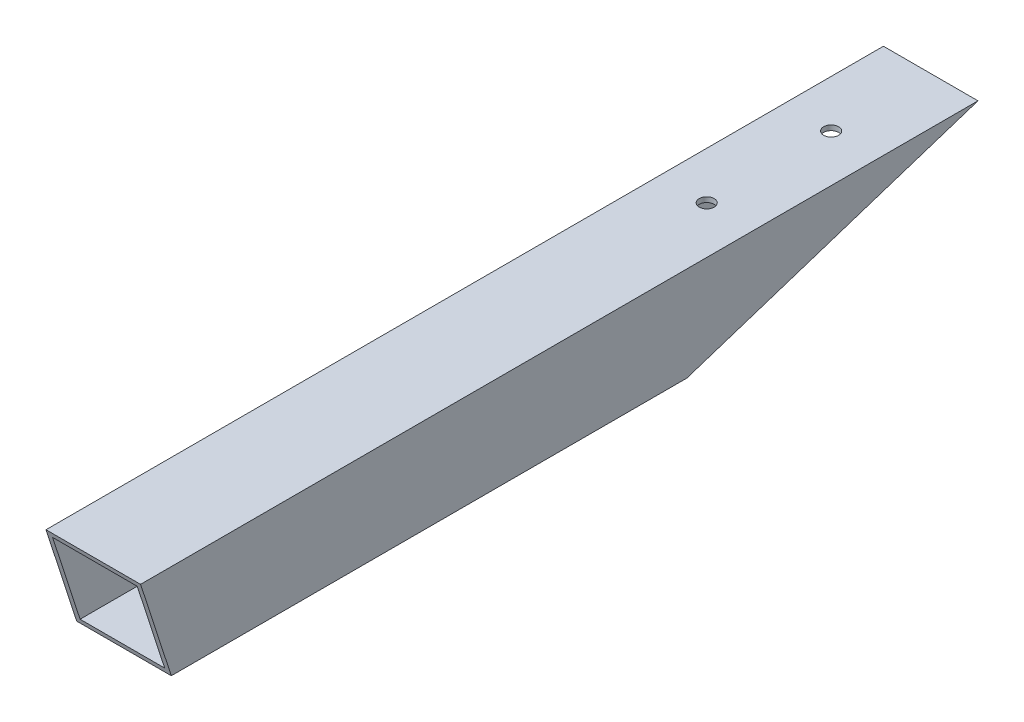
ISO-10303-21;
HEADER;
FILE_DESCRIPTION(('STEP AP214'),'2;1');
FILE_NAME('part.step','',(''),(''),'','','');
FILE_SCHEMA(('AUTOMOTIVE_DESIGN { 1 0 10303 214 1 1 1 1 }'));
ENDSEC;
DATA;
#1=APPLICATION_CONTEXT('core data for automotive mechanical design processes');
#2=APPLICATION_PROTOCOL_DEFINITION('international standard','automotive_design',2000,#1);
#3=PRODUCT_CONTEXT('',#1,'mechanical');
#4=PRODUCT('Part','Part','',(#3));
#5=PRODUCT_RELATED_PRODUCT_CATEGORY('part','',(#4));
#6=PRODUCT_DEFINITION_FORMATION('','',#4);
#7=PRODUCT_DEFINITION_CONTEXT('part definition',#1,'design');
#8=PRODUCT_DEFINITION('design','',#6,#7);
#9=PRODUCT_DEFINITION_SHAPE('','',#8);
#10=(LENGTH_UNIT() NAMED_UNIT(*) SI_UNIT(.MILLI.,.METRE.));
#11=(NAMED_UNIT(*) PLANE_ANGLE_UNIT() SI_UNIT($,.RADIAN.));
#12=(NAMED_UNIT(*) SI_UNIT($,.STERADIAN.) SOLID_ANGLE_UNIT());
#13=UNCERTAINTY_MEASURE_WITH_UNIT(LENGTH_MEASURE(1.E-05),#10,'distance_accuracy_value','');
#14=(GEOMETRIC_REPRESENTATION_CONTEXT(3) GLOBAL_UNCERTAINTY_ASSIGNED_CONTEXT((#13)) GLOBAL_UNIT_ASSIGNED_CONTEXT((#10,
#11,#12)) REPRESENTATION_CONTEXT('',''));
#15=CARTESIAN_POINT('',(0.,0.,0.));
#16=DIRECTION('',(0.,0.,1.));
#17=DIRECTION('',(1.,0.,0.));
#18=AXIS2_PLACEMENT_3D('',#15,#16,#17);
#19=CARTESIAN_POINT('',(9.5,9.5,260.));
#20=DIRECTION('',(-1.,0.,0.));
#21=DIRECTION('',(0.,0.,1.));
#22=AXIS2_PLACEMENT_3D('',#19,#20,#21);
#23=PLANE('',#22);
#24=DIRECTION('',(0.,0.,-1.));
#25=VECTOR('',#24,1.);
#26=CARTESIAN_POINT('',(9.5,9.5,260.));
#27=LINE('',#26,#25);
#28=CARTESIAN_POINT('',(9.5,9.5,168.233955878122));
#29=VERTEX_POINT('',#28);
#30=CARTESIAN_POINT('',(9.5,9.5,0.));
#31=VERTEX_POINT('',#30);
#32=EDGE_CURVE('E112',#29,#31,#27,.T.);
#33=ORIENTED_EDGE('',*,*,#32,.F.);
#34=DIRECTION('',(0.,0.951056516295156,0.309016994374941));
#35=VECTOR('',#34,1.);
#36=CARTESIAN_POINT('',(9.5,10.4737170732223,168.550335733771));
#37=LINE('',#36,#35);
#38=CARTESIAN_POINT('',(9.5,-9.5,162.060481649697));
#39=VERTEX_POINT('',#38);
#40=EDGE_CURVE('E100',#39,#29,#37,.T.);
#41=ORIENTED_EDGE('',*,*,#40,.F.);
#42=DIRECTION('',(0.,0.,-1.));
#43=VECTOR('',#42,1.);
#44=CARTESIAN_POINT('',(9.5,-9.5,260.));
#45=LINE('',#44,#43);
#46=CARTESIAN_POINT('',(9.5,-9.5,58.475987206331));
#47=VERTEX_POINT('',#46);
#48=EDGE_CURVE('E110',#39,#47,#45,.T.);
#49=ORIENTED_EDGE('',*,*,#48,.T.);
#50=DIRECTION('',(0.,-0.309016994374942,0.951056516295155));
#51=VECTOR('',#50,1.);
#52=CARTESIAN_POINT('',(9.5,9.5,0.));
#53=LINE('',#52,#51);
#54=EDGE_CURVE('E152',#31,#47,#53,.T.);
#55=ORIENTED_EDGE('',*,*,#54,.F.);
#56=EDGE_LOOP('',(#33,#41,#49,#55));
#57=FACE_BOUND('',#56,.T.);
#58=ADVANCED_FACE('F35',(#57),#23,.F.);
#59=CARTESIAN_POINT('',(-9.5,9.5,260.));
#60=DIRECTION('',(0.,-1.,0.));
#61=DIRECTION('',(0.,0.,-1.));
#62=AXIS2_PLACEMENT_3D('',#59,#60,#61);
#63=PLANE('',#62);
#64=CARTESIAN_POINT('',(0.,9.5,20.));
#65=DIRECTION('',(0.,1.,0.));
#66=DIRECTION('',(0.,0.,1.));
#67=AXIS2_PLACEMENT_3D('',#64,#65,#66);
#68=CIRCLE('',#67,1.5);
#69=CARTESIAN_POINT('',(0.,9.5,21.5));
#70=VERTEX_POINT('',#69);
#71=EDGE_CURVE('E133',#70,#70,#68,.T.);
#72=ORIENTED_EDGE('',*,*,#71,.F.);
#73=EDGE_LOOP('',(#72));
#74=FACE_BOUND('',#73,.T.);
#75=CARTESIAN_POINT('',(0.,9.5,45.));
#76=DIRECTION('',(0.,1.,0.));
#77=DIRECTION('',(0.,0.,1.));
#78=AXIS2_PLACEMENT_3D('',#75,#76,#77);
#79=CIRCLE('',#78,1.5);
#80=CARTESIAN_POINT('',(0.,9.5,46.5));
#81=VERTEX_POINT('',#80);
#82=EDGE_CURVE('E138',#81,#81,#79,.T.);
#83=ORIENTED_EDGE('',*,*,#82,.F.);
#84=EDGE_LOOP('',(#83));
#85=FACE_BOUND('',#84,.T.);
#86=DIRECTION('',(0.,0.,-1.));
#87=VECTOR('',#86,1.);
#88=CARTESIAN_POINT('',(-9.5,9.5,260.));
#89=LINE('',#88,#87);
#90=CARTESIAN_POINT('',(-9.5,9.5,168.233955878122));
#91=VERTEX_POINT('',#90);
#92=CARTESIAN_POINT('',(-9.5,9.5,0.));
#93=VERTEX_POINT('',#92);
#94=EDGE_CURVE('E121',#91,#93,#89,.T.);
#95=ORIENTED_EDGE('',*,*,#94,.F.);
#96=DIRECTION('',(1.,0.,0.));
#97=VECTOR('',#96,1.);
#98=CARTESIAN_POINT('',(-9.5,9.5,168.233955878122));
#99=LINE('',#98,#97);
#100=EDGE_CURVE('E105',#91,#29,#99,.T.);
#101=ORIENTED_EDGE('',*,*,#100,.T.);
#102=ORIENTED_EDGE('',*,*,#32,.T.);
#103=DIRECTION('',(-1.,0.,0.));
#104=VECTOR('',#103,1.);
#105=CARTESIAN_POINT('',(-9.5,9.5,0.));
#106=LINE('',#105,#104);
#107=EDGE_CURVE('E119',#31,#93,#106,.T.);
#108=ORIENTED_EDGE('',*,*,#107,.T.);
#109=EDGE_LOOP('',(#95,#101,#102,#108));
#110=FACE_BOUND('',#109,.T.);
#111=ADVANCED_FACE('F204',(#74,#85,#110),#63,.F.);
#112=CARTESIAN_POINT('',(-9.5,9.5,260.));
#113=DIRECTION('',(1.,0.,0.));
#114=DIRECTION('',(0.,1.,0.));
#115=AXIS2_PLACEMENT_3D('',#112,#113,#114);
#116=PLANE('',#115);
#117=DIRECTION('',(0.,0.,-1.));
#118=VECTOR('',#117,1.);
#119=CARTESIAN_POINT('',(-9.5,-9.5,260.));
#120=LINE('',#119,#118);
#121=CARTESIAN_POINT('',(-9.5,-9.5,162.060481649697));
#122=VERTEX_POINT('',#121);
#123=CARTESIAN_POINT('',(-9.5,-9.5,58.475987206331));
#124=VERTEX_POINT('',#123);
#125=EDGE_CURVE('E118',#122,#124,#120,.T.);
#126=ORIENTED_EDGE('',*,*,#125,.F.);
#127=DIRECTION('',(0.,0.951056516295156,0.309016994374941));
#128=VECTOR('',#127,1.);
#129=CARTESIAN_POINT('',(-9.5,59.6111960038957,184.516070461575));
#130=LINE('',#129,#128);
#131=EDGE_CURVE('E51',#122,#91,#130,.T.);
#132=ORIENTED_EDGE('',*,*,#131,.T.);
#133=ORIENTED_EDGE('',*,*,#94,.T.);
#134=DIRECTION('',(0.,-0.309016994374942,0.951056516295155));
#135=VECTOR('',#134,1.);
#136=CARTESIAN_POINT('',(-9.5,9.5,0.));
#137=LINE('',#136,#135);
#138=EDGE_CURVE('E153',#93,#124,#137,.T.);
#139=ORIENTED_EDGE('',*,*,#138,.T.);
#140=EDGE_LOOP('',(#126,#132,#133,#139));
#141=FACE_BOUND('',#140,.T.);
#142=ADVANCED_FACE('F208',(#141),#116,.F.);
#143=CARTESIAN_POINT('',(-9.5,-9.5,260.));
#144=DIRECTION('',(0.,1.,0.));
#145=DIRECTION('',(-1.,0.,0.));
#146=AXIS2_PLACEMENT_3D('',#143,#144,#145);
#147=PLANE('',#146);
#148=ORIENTED_EDGE('',*,*,#48,.F.);
#149=DIRECTION('',(-1.,0.,0.));
#150=VECTOR('',#149,1.);
#151=CARTESIAN_POINT('',(-9.5,-9.5,162.060481649697));
#152=LINE('',#151,#150);
#153=EDGE_CURVE('E97',#39,#122,#152,.T.);
#154=ORIENTED_EDGE('',*,*,#153,.T.);
#155=ORIENTED_EDGE('',*,*,#125,.T.);
#156=DIRECTION('',(1.,0.,0.));
#157=VECTOR('',#156,1.);
#158=CARTESIAN_POINT('',(-9.5,-9.5,58.475987206331));
#159=LINE('',#158,#157);
#160=EDGE_CURVE('E117',#124,#47,#159,.T.);
#161=ORIENTED_EDGE('',*,*,#160,.T.);
#162=EDGE_LOOP('',(#148,#154,#155,#161));
#163=FACE_BOUND('',#162,.T.);
#164=ADVANCED_FACE('F115',(#163),#147,.F.);
#165=CARTESIAN_POINT('',(8.5,9.5,260.));
#166=DIRECTION('',(-1.,0.,0.));
#167=DIRECTION('',(0.,0.,1.));
#168=AXIS2_PLACEMENT_3D('',#165,#166,#167);
#169=PLANE('',#168);
#170=DIRECTION('',(0.,-0.951056516295156,-0.309016994374941));
#171=VECTOR('',#170,1.);
#172=CARTESIAN_POINT('',(8.5,36.4693636980295,176.996833338481));
#173=LINE('',#172,#171);
#174=CARTESIAN_POINT('',(8.49999999999999,8.5,167.90903618189));
#175=VERTEX_POINT('',#174);
#176=CARTESIAN_POINT('',(8.5,-8.49999999999999,162.38540134593));
#177=VERTEX_POINT('',#176);
#178=EDGE_CURVE('E58',#175,#177,#173,.T.);
#179=ORIENTED_EDGE('',*,*,#178,.F.);
#180=DIRECTION('',(0.,0.,-1.));
#181=VECTOR('',#180,1.);
#182=CARTESIAN_POINT('',(8.5,8.5,260.));
#183=LINE('',#182,#181);
#184=CARTESIAN_POINT('',(8.49999999999999,8.5,3.0776835371753));
#185=VERTEX_POINT('',#184);
#186=EDGE_CURVE('E124',#175,#185,#183,.T.);
#187=ORIENTED_EDGE('',*,*,#186,.T.);
#188=DIRECTION('',(0.,0.309016994374942,-0.951056516295156));
#189=VECTOR('',#188,1.);
#190=CARTESIAN_POINT('',(8.5,-66.9120827980202,235.172209268744));
#191=LINE('',#190,#189);
#192=CARTESIAN_POINT('',(8.49999999999999,-8.5,55.3983036691557));
#193=VERTEX_POINT('',#192);
#194=EDGE_CURVE('E164',#193,#185,#191,.T.);
#195=ORIENTED_EDGE('',*,*,#194,.F.);
#196=DIRECTION('',(0.,0.,-1.));
#197=VECTOR('',#196,1.);
#198=CARTESIAN_POINT('',(8.5,-8.49999999999999,260.));
#199=LINE('',#198,#197);
#200=EDGE_CURVE('E167',#177,#193,#199,.T.);
#201=ORIENTED_EDGE('',*,*,#200,.F.);
#202=EDGE_LOOP('',(#179,#187,#195,#201));
#203=FACE_BOUND('',#202,.T.);
#204=ADVANCED_FACE('F188',(#203),#169,.T.);
#205=CARTESIAN_POINT('',(-9.5,8.5,260.));
#206=DIRECTION('',(0.,-1.,0.));
#207=DIRECTION('',(0.,0.,-1.));
#208=AXIS2_PLACEMENT_3D('',#205,#206,#207);
#209=PLANE('',#208);
#210=CARTESIAN_POINT('',(0.,8.5,20.));
#211=DIRECTION('',(0.,-1.,0.));
#212=DIRECTION('',(0.,0.,-1.));
#213=AXIS2_PLACEMENT_3D('',#210,#211,#212);
#214=CIRCLE('',#213,1.5);
#215=CARTESIAN_POINT('',(0.,8.5,18.5));
#216=VERTEX_POINT('',#215);
#217=EDGE_CURVE('E38',#216,#216,#214,.T.);
#218=ORIENTED_EDGE('',*,*,#217,.F.);
#219=EDGE_LOOP('',(#218));
#220=FACE_BOUND('',#219,.T.);
#221=CARTESIAN_POINT('',(0.,8.5,45.));
#222=DIRECTION('',(0.,-1.,0.));
#223=DIRECTION('',(0.,0.,-1.));
#224=AXIS2_PLACEMENT_3D('',#221,#222,#223);
#225=CIRCLE('',#224,1.5);
#226=CARTESIAN_POINT('',(0.,8.5,43.5));
#227=VERTEX_POINT('',#226);
#228=EDGE_CURVE('E131',#227,#227,#225,.T.);
#229=ORIENTED_EDGE('',*,*,#228,.F.);
#230=EDGE_LOOP('',(#229));
#231=FACE_BOUND('',#230,.T.);
#232=DIRECTION('',(1.,0.,0.));
#233=VECTOR('',#232,1.);
#234=CARTESIAN_POINT('',(-9.5,8.5,167.90903618189));
#235=LINE('',#234,#233);
#236=CARTESIAN_POINT('',(-8.5,8.5,167.90903618189));
#237=VERTEX_POINT('',#236);
#238=EDGE_CURVE('E148',#237,#175,#235,.T.);
#239=ORIENTED_EDGE('',*,*,#238,.F.);
#240=DIRECTION('',(0.,0.,-1.));
#241=VECTOR('',#240,1.);
#242=CARTESIAN_POINT('',(-8.5,8.5,260.));
#243=LINE('',#242,#241);
#244=CARTESIAN_POINT('',(-8.5,8.49999999999999,3.0776835371753));
#245=VERTEX_POINT('',#244);
#246=EDGE_CURVE('E169',#237,#245,#243,.T.);
#247=ORIENTED_EDGE('',*,*,#246,.T.);
#248=DIRECTION('',(-1.,0.,0.));
#249=VECTOR('',#248,1.);
#250=CARTESIAN_POINT('',(-9.5,8.5,3.0776835371753));
#251=LINE('',#250,#249);
#252=EDGE_CURVE('E161',#185,#245,#251,.T.);
#253=ORIENTED_EDGE('',*,*,#252,.F.);
#254=ORIENTED_EDGE('',*,*,#186,.F.);
#255=EDGE_LOOP('',(#239,#247,#253,#254));
#256=FACE_BOUND('',#255,.T.);
#257=ADVANCED_FACE('F192',(#220,#231,#256),#209,.T.);
#258=CARTESIAN_POINT('',(-8.5,9.5,260.));
#259=DIRECTION('',(1.,0.,0.));
#260=DIRECTION('',(0.,1.,0.));
#261=AXIS2_PLACEMENT_3D('',#258,#259,#260);
#262=PLANE('',#261);
#263=DIRECTION('',(0.,0.951056516295156,0.309016994374941));
#264=VECTOR('',#263,1.);
#265=CARTESIAN_POINT('',(-8.50000000000001,36.4693636980295,176.996833338481));
#266=LINE('',#265,#264);
#267=CARTESIAN_POINT('',(-8.5,-8.5,162.38540134593));
#268=VERTEX_POINT('',#267);
#269=EDGE_CURVE('E145',#268,#237,#266,.T.);
#270=ORIENTED_EDGE('',*,*,#269,.F.);
#271=DIRECTION('',(0.,0.,-1.));
#272=VECTOR('',#271,1.);
#273=CARTESIAN_POINT('',(-8.5,-8.5,260.));
#274=LINE('',#273,#272);
#275=CARTESIAN_POINT('',(-8.5,-8.5,55.3983036691557));
#276=VERTEX_POINT('',#275);
#277=EDGE_CURVE('E171',#268,#276,#274,.T.);
#278=ORIENTED_EDGE('',*,*,#277,.T.);
#279=DIRECTION('',(0.,-0.309016994374942,0.951056516295156));
#280=VECTOR('',#279,1.);
#281=CARTESIAN_POINT('',(-8.49999999999999,-66.9120827980202,235.172209268744));
#282=LINE('',#281,#280);
#283=EDGE_CURVE('E158',#245,#276,#282,.T.);
#284=ORIENTED_EDGE('',*,*,#283,.F.);
#285=ORIENTED_EDGE('',*,*,#246,.F.);
#286=EDGE_LOOP('',(#270,#278,#284,#285));
#287=FACE_BOUND('',#286,.T.);
#288=ADVANCED_FACE('F176',(#287),#262,.T.);
#289=CARTESIAN_POINT('',(-9.5,-8.5,260.));
#290=DIRECTION('',(0.,1.,0.));
#291=DIRECTION('',(-1.,0.,0.));
#292=AXIS2_PLACEMENT_3D('',#289,#290,#291);
#293=PLANE('',#292);
#294=DIRECTION('',(-1.,0.,0.));
#295=VECTOR('',#294,1.);
#296=CARTESIAN_POINT('',(-9.5,-8.5,162.38540134593));
#297=LINE('',#296,#295);
#298=EDGE_CURVE('E11',#177,#268,#297,.T.);
#299=ORIENTED_EDGE('',*,*,#298,.F.);
#300=ORIENTED_EDGE('',*,*,#200,.T.);
#301=DIRECTION('',(1.,0.,0.));
#302=VECTOR('',#301,1.);
#303=CARTESIAN_POINT('',(-9.49999999999994,-8.5,55.3983036691557));
#304=LINE('',#303,#302);
#305=EDGE_CURVE('E43',#276,#193,#304,.T.);
#306=ORIENTED_EDGE('',*,*,#305,.F.);
#307=ORIENTED_EDGE('',*,*,#277,.F.);
#308=EDGE_LOOP('',(#299,#300,#306,#307));
#309=FACE_BOUND('',#308,.T.);
#310=ADVANCED_FACE('F185',(#309),#293,.T.);
#311=CARTESIAN_POINT('',(-9.5,9.5,0.));
#312=DIRECTION('',(0.,0.951056516295155,0.309016994374942));
#313=DIRECTION('',(0.,-0.309016994374942,0.951056516295156));
#314=AXIS2_PLACEMENT_3D('',#311,#312,#313);
#315=PLANE('',#314);
#316=ORIENTED_EDGE('',*,*,#194,.T.);
#317=ORIENTED_EDGE('',*,*,#252,.T.);
#318=ORIENTED_EDGE('',*,*,#283,.T.);
#319=ORIENTED_EDGE('',*,*,#305,.T.);
#320=EDGE_LOOP('',(#316,#317,#318,#319));
#321=FACE_BOUND('',#320,.T.);
#322=ORIENTED_EDGE('',*,*,#54,.T.);
#323=ORIENTED_EDGE('',*,*,#160,.F.);
#324=ORIENTED_EDGE('',*,*,#138,.F.);
#325=ORIENTED_EDGE('',*,*,#107,.F.);
#326=EDGE_LOOP('',(#322,#323,#324,#325));
#327=FACE_BOUND('',#326,.T.);
#328=ADVANCED_FACE('F181',(#321,#327),#315,.F.);
#329=CARTESIAN_POINT('',(-9.5,10.4737170732223,168.550335733771));
#330=DIRECTION('',(0.,0.309016994374941,-0.951056516295156));
#331=DIRECTION('',(0.,0.951056516295156,0.309016994374941));
#332=AXIS2_PLACEMENT_3D('',#329,#330,#331);
#333=PLANE('',#332);
#334=ORIENTED_EDGE('',*,*,#178,.T.);
#335=ORIENTED_EDGE('',*,*,#298,.T.);
#336=ORIENTED_EDGE('',*,*,#269,.T.);
#337=ORIENTED_EDGE('',*,*,#238,.T.);
#338=EDGE_LOOP('',(#334,#335,#336,#337));
#339=FACE_BOUND('',#338,.T.);
#340=ORIENTED_EDGE('',*,*,#131,.F.);
#341=ORIENTED_EDGE('',*,*,#153,.F.);
#342=ORIENTED_EDGE('',*,*,#40,.T.);
#343=ORIENTED_EDGE('',*,*,#100,.F.);
#344=EDGE_LOOP('',(#340,#341,#342,#343));
#345=FACE_BOUND('',#344,.T.);
#346=ADVANCED_FACE('F99',(#339,#345),#333,.F.);
#347=CARTESIAN_POINT('',(0.,-9.5,45.));
#348=DIRECTION('',(0.,1.,0.));
#349=DIRECTION('',(0.,0.,1.));
#350=AXIS2_PLACEMENT_3D('',#347,#348,#349);
#351=CYLINDRICAL_SURFACE('',#350,1.5);
#352=ORIENTED_EDGE('',*,*,#228,.T.);
#353=EDGE_LOOP('',(#352));
#354=FACE_BOUND('',#353,.T.);
#355=ORIENTED_EDGE('',*,*,#82,.T.);
#356=EDGE_LOOP('',(#355));
#357=FACE_BOUND('',#356,.T.);
#358=ADVANCED_FACE('F194',(#354,#357),#351,.F.);
#359=CARTESIAN_POINT('',(0.,-9.5,20.));
#360=DIRECTION('',(0.,1.,0.));
#361=DIRECTION('',(0.,0.,1.));
#362=AXIS2_PLACEMENT_3D('',#359,#360,#361);
#363=CYLINDRICAL_SURFACE('',#362,1.5);
#364=ORIENTED_EDGE('',*,*,#217,.T.);
#365=EDGE_LOOP('',(#364));
#366=FACE_BOUND('',#365,.T.);
#367=ORIENTED_EDGE('',*,*,#71,.T.);
#368=EDGE_LOOP('',(#367));
#369=FACE_BOUND('',#368,.T.);
#370=ADVANCED_FACE('F200',(#366,#369),#363,.F.);
#371=CLOSED_SHELL('',(#58,#111,#142,#164,#204,#257,#288,#310,#328,#346,#358,#370));
#372=MANIFOLD_SOLID_BREP('B2',#371);
#373=ADVANCED_BREP_SHAPE_REPRESENTATION('',(#18,#372),#14);
#374=SHAPE_DEFINITION_REPRESENTATION(#9,#373);
ENDSEC;
END-ISO-10303-21;
